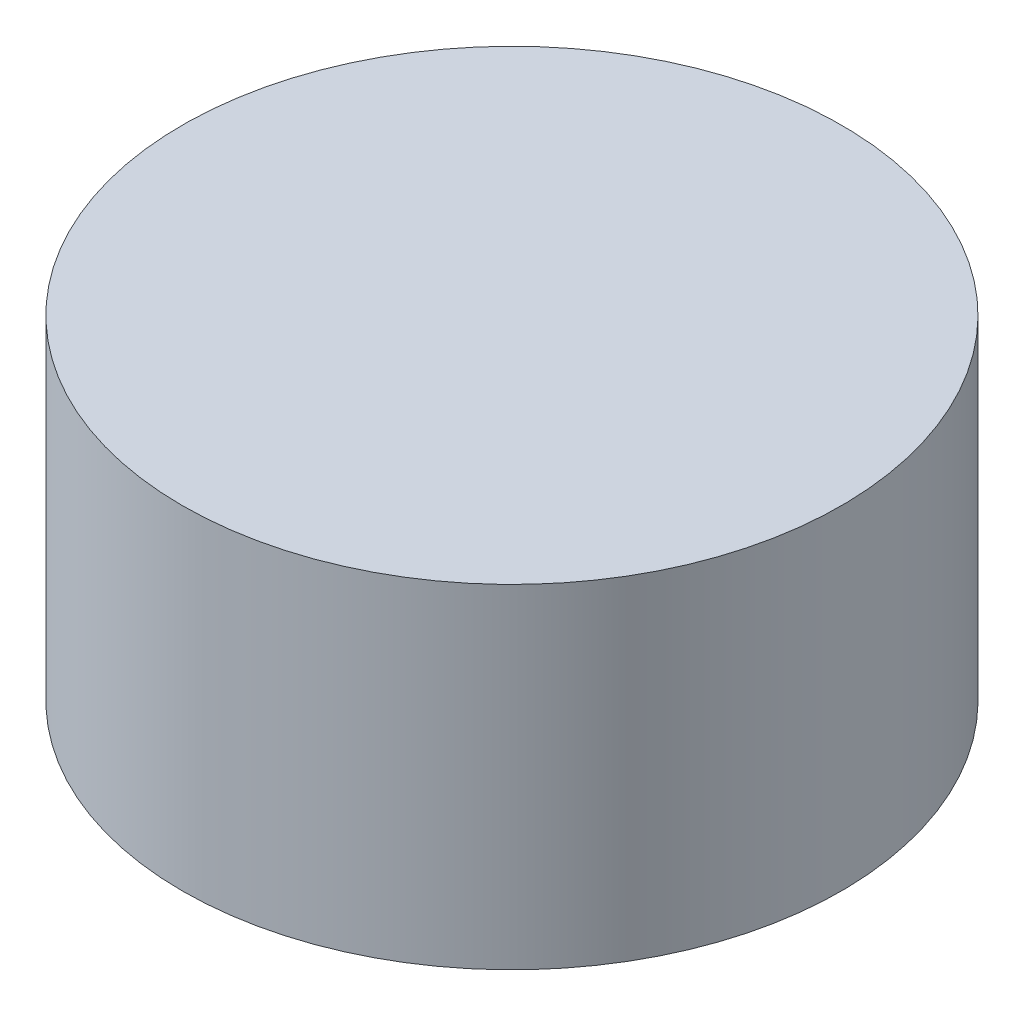
ISO-10303-21;
HEADER;
FILE_DESCRIPTION(('STEP AP214'),'2;1');
FILE_NAME('part.step','',(''),(''),'','','');
FILE_SCHEMA(('AUTOMOTIVE_DESIGN { 1 0 10303 214 1 1 1 1 }'));
ENDSEC;
DATA;
#1=APPLICATION_CONTEXT('core data for automotive mechanical design processes');
#2=APPLICATION_PROTOCOL_DEFINITION('international standard','automotive_design',2000,#1);
#3=PRODUCT_CONTEXT('',#1,'mechanical');
#4=PRODUCT('Part','Part','',(#3));
#5=PRODUCT_RELATED_PRODUCT_CATEGORY('part','',(#4));
#6=PRODUCT_DEFINITION_FORMATION('','',#4);
#7=PRODUCT_DEFINITION_CONTEXT('part definition',#1,'design');
#8=PRODUCT_DEFINITION('design','',#6,#7);
#9=PRODUCT_DEFINITION_SHAPE('','',#8);
#10=(LENGTH_UNIT() NAMED_UNIT(*) SI_UNIT(.MILLI.,.METRE.));
#11=(NAMED_UNIT(*) PLANE_ANGLE_UNIT() SI_UNIT($,.RADIAN.));
#12=(NAMED_UNIT(*) SI_UNIT($,.STERADIAN.) SOLID_ANGLE_UNIT());
#13=UNCERTAINTY_MEASURE_WITH_UNIT(LENGTH_MEASURE(1.E-05),#10,'distance_accuracy_value','');
#14=(GEOMETRIC_REPRESENTATION_CONTEXT(3) GLOBAL_UNCERTAINTY_ASSIGNED_CONTEXT((#13)) GLOBAL_UNIT_ASSIGNED_CONTEXT((#10,
#11,#12)) REPRESENTATION_CONTEXT('',''));
#15=CARTESIAN_POINT('',(0.,0.,0.));
#16=DIRECTION('',(0.,0.,1.));
#17=DIRECTION('',(1.,0.,0.));
#18=AXIS2_PLACEMENT_3D('',#15,#16,#17);
#19=CARTESIAN_POINT('',(0.,4.,0.));
#20=DIRECTION('',(0.,-1.,0.));
#21=DIRECTION('',(0.,0.,-1.));
#22=AXIS2_PLACEMENT_3D('',#19,#20,#21);
#23=CYLINDRICAL_SURFACE('',#22,3.95);
#24=CARTESIAN_POINT('',(0.,4.,0.));
#25=DIRECTION('',(0.,1.,0.));
#26=DIRECTION('',(0.,0.,1.));
#27=AXIS2_PLACEMENT_3D('',#24,#25,#26);
#28=CIRCLE('',#27,3.95);
#29=CARTESIAN_POINT('',(0.,4.,3.95));
#30=VERTEX_POINT('',#29);
#31=EDGE_CURVE('E10',#30,#30,#28,.T.);
#32=ORIENTED_EDGE('',*,*,#31,.F.);
#33=EDGE_LOOP('',(#32));
#34=FACE_BOUND('',#33,.T.);
#35=CARTESIAN_POINT('',(0.,0.,0.));
#36=DIRECTION('',(0.,1.,0.));
#37=DIRECTION('',(0.,0.,1.));
#38=AXIS2_PLACEMENT_3D('',#35,#36,#37);
#39=CIRCLE('',#38,3.95);
#40=CARTESIAN_POINT('',(0.,0.,3.95));
#41=VERTEX_POINT('',#40);
#42=EDGE_CURVE('E35',#41,#41,#39,.T.);
#43=ORIENTED_EDGE('',*,*,#42,.T.);
#44=EDGE_LOOP('',(#43));
#45=FACE_BOUND('',#44,.T.);
#46=ADVANCED_FACE('F32',(#34,#45),#23,.T.);
#47=CARTESIAN_POINT('',(0.,4.,0.));
#48=DIRECTION('',(0.,1.,0.));
#49=DIRECTION('',(0.,0.,1.));
#50=AXIS2_PLACEMENT_3D('',#47,#48,#49);
#51=PLANE('',#50);
#52=ORIENTED_EDGE('',*,*,#31,.T.);
#53=EDGE_LOOP('',(#52));
#54=FACE_BOUND('',#53,.T.);
#55=ADVANCED_FACE('F47',(#54),#51,.T.);
#56=CARTESIAN_POINT('',(0.,0.,0.));
#57=DIRECTION('',(0.,1.,0.));
#58=DIRECTION('',(0.,0.,1.));
#59=AXIS2_PLACEMENT_3D('',#56,#57,#58);
#60=PLANE('',#59);
#61=ORIENTED_EDGE('',*,*,#42,.F.);
#62=EDGE_LOOP('',(#61));
#63=FACE_BOUND('',#62,.T.);
#64=ADVANCED_FACE('F45',(#63),#60,.F.);
#65=CLOSED_SHELL('',(#46,#55,#64));
#66=MANIFOLD_SOLID_BREP('B2',#65);
#67=ADVANCED_BREP_SHAPE_REPRESENTATION('',(#18,#66),#14);
#68=SHAPE_DEFINITION_REPRESENTATION(#9,#67);
ENDSEC;
END-ISO-10303-21;
